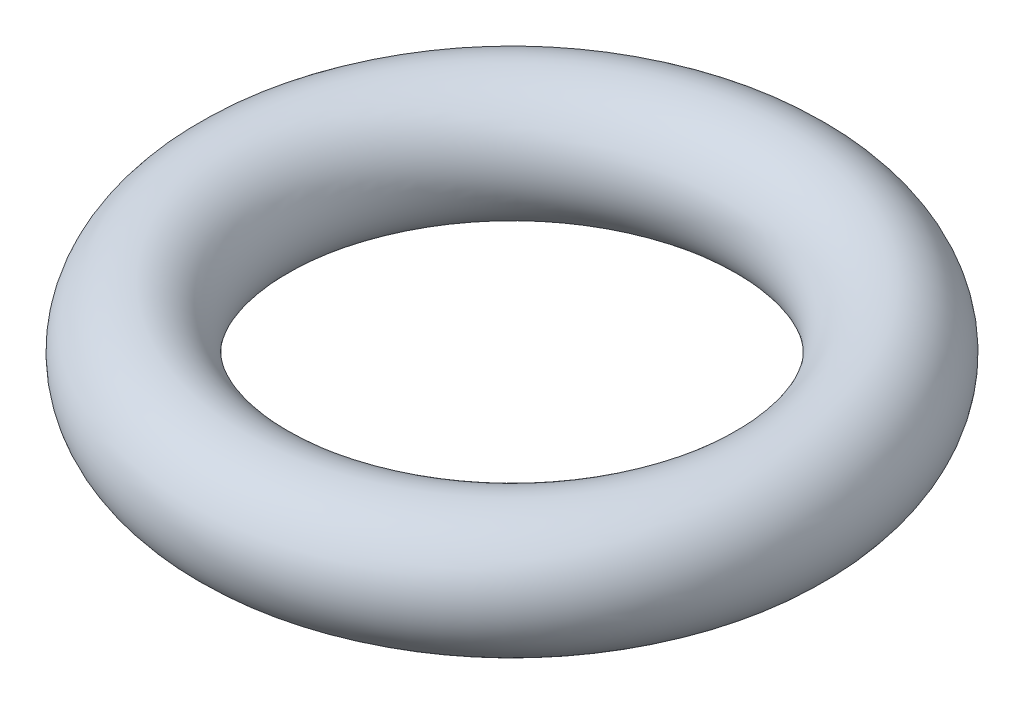
ISO-10303-21;
HEADER;
FILE_DESCRIPTION(('STEP AP214'),'2;1');
FILE_NAME('part.step','',(''),(''),'','','');
FILE_SCHEMA(('AUTOMOTIVE_DESIGN { 1 0 10303 214 1 1 1 1 }'));
ENDSEC;
DATA;
#1=APPLICATION_CONTEXT('core data for automotive mechanical design processes');
#2=APPLICATION_PROTOCOL_DEFINITION('international standard','automotive_design',2000,#1);
#3=PRODUCT_CONTEXT('',#1,'mechanical');
#4=PRODUCT('Part','Part','',(#3));
#5=PRODUCT_RELATED_PRODUCT_CATEGORY('part','',(#4));
#6=PRODUCT_DEFINITION_FORMATION('','',#4);
#7=PRODUCT_DEFINITION_CONTEXT('part definition',#1,'design');
#8=PRODUCT_DEFINITION('design','',#6,#7);
#9=PRODUCT_DEFINITION_SHAPE('','',#8);
#10=(LENGTH_UNIT() NAMED_UNIT(*) SI_UNIT(.MILLI.,.METRE.));
#11=(NAMED_UNIT(*) PLANE_ANGLE_UNIT() SI_UNIT($,.RADIAN.));
#12=(NAMED_UNIT(*) SI_UNIT($,.STERADIAN.) SOLID_ANGLE_UNIT());
#13=UNCERTAINTY_MEASURE_WITH_UNIT(LENGTH_MEASURE(1.E-05),#10,'distance_accuracy_value','');
#14=(GEOMETRIC_REPRESENTATION_CONTEXT(3) GLOBAL_UNCERTAINTY_ASSIGNED_CONTEXT((#13)) GLOBAL_UNIT_ASSIGNED_CONTEXT((#10,
#11,#12)) REPRESENTATION_CONTEXT('',''));
#15=CARTESIAN_POINT('',(0.,0.,0.));
#16=DIRECTION('',(0.,0.,1.));
#17=DIRECTION('',(1.,0.,0.));
#18=AXIS2_PLACEMENT_3D('',#15,#16,#17);
#19=CARTESIAN_POINT('',(0.,0.,0.));
#20=DIRECTION('',(0.,-1.,0.));
#21=DIRECTION('',(0.,0.,-1.));
#22=AXIS2_PLACEMENT_3D('',#19,#20,#21);
#23=TOROIDAL_SURFACE('',#22,6.5,1.5);
#24=CARTESIAN_POINT('',(0.,0.,-8.));
#25=VERTEX_POINT('',#24);
#26=VERTEX_LOOP('',#25);
#27=FACE_BOUND('',#26,.T.);
#28=ADVANCED_FACE('F29',(#27),#23,.T.);
#29=CLOSED_SHELL('',(#28));
#30=MANIFOLD_SOLID_BREP('B2',#29);
#31=ADVANCED_BREP_SHAPE_REPRESENTATION('',(#18,#30),#14);
#32=SHAPE_DEFINITION_REPRESENTATION(#9,#31);
ENDSEC;
END-ISO-10303-21;
